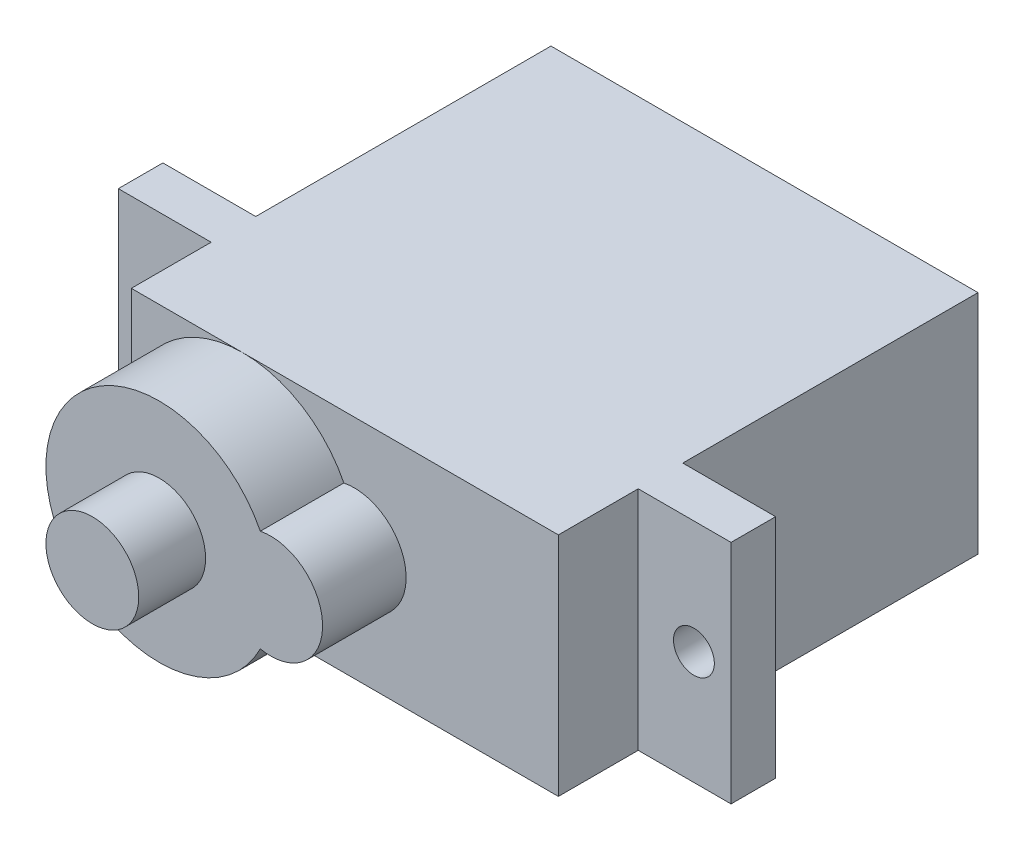
ISO-10303-21;
HEADER;
FILE_DESCRIPTION(('STEP AP214'),'2;1');
FILE_NAME('part.step','',(''),(''),'','','');
FILE_SCHEMA(('AUTOMOTIVE_DESIGN { 1 0 10303 214 1 1 1 1 }'));
ENDSEC;
DATA;
#1=APPLICATION_CONTEXT('core data for automotive mechanical design processes');
#2=APPLICATION_PROTOCOL_DEFINITION('international standard','automotive_design',2000,#1);
#3=PRODUCT_CONTEXT('',#1,'mechanical');
#4=PRODUCT('Part','Part','',(#3));
#5=PRODUCT_RELATED_PRODUCT_CATEGORY('part','',(#4));
#6=PRODUCT_DEFINITION_FORMATION('','',#4);
#7=PRODUCT_DEFINITION_CONTEXT('part definition',#1,'design');
#8=PRODUCT_DEFINITION('design','',#6,#7);
#9=PRODUCT_DEFINITION_SHAPE('','',#8);
#10=(LENGTH_UNIT() NAMED_UNIT(*) SI_UNIT(.MILLI.,.METRE.));
#11=(NAMED_UNIT(*) PLANE_ANGLE_UNIT() SI_UNIT($,.RADIAN.));
#12=(NAMED_UNIT(*) SI_UNIT($,.STERADIAN.) SOLID_ANGLE_UNIT());
#13=UNCERTAINTY_MEASURE_WITH_UNIT(LENGTH_MEASURE(1.E-05),#10,'distance_accuracy_value','');
#14=(GEOMETRIC_REPRESENTATION_CONTEXT(3) GLOBAL_UNCERTAINTY_ASSIGNED_CONTEXT((#13)) GLOBAL_UNIT_ASSIGNED_CONTEXT((#10,
#11,#12)) REPRESENTATION_CONTEXT('',''));
#15=CARTESIAN_POINT('',(0.,0.,0.));
#16=DIRECTION('',(0.,0.,1.));
#17=DIRECTION('',(1.,0.,0.));
#18=AXIS2_PLACEMENT_3D('',#15,#16,#17);
#19=CARTESIAN_POINT('',(0.,0.,8.8));
#20=DIRECTION('',(0.,0.,-1.));
#21=DIRECTION('',(-1.,0.,0.));
#22=AXIS2_PLACEMENT_3D('',#19,#20,#21);
#23=CYLINDRICAL_SURFACE('',#22,6.1);
#24=DIRECTION('',(0.,0.,-1.));
#25=VECTOR('',#24,1.);
#26=CARTESIAN_POINT('',(5.4475,-2.74494877001375,6.55));
#27=LINE('',#26,#25);
#28=CARTESIAN_POINT('',(5.4475,-2.74494877001375,8.8));
#29=VERTEX_POINT('',#28);
#30=CARTESIAN_POINT('',(5.4475,-2.74494877001375,4.3));
#31=VERTEX_POINT('',#30);
#32=EDGE_CURVE('E154',#29,#31,#27,.T.);
#33=ORIENTED_EDGE('',*,*,#32,.F.);
#34=CARTESIAN_POINT('',(0.,0.,8.8));
#35=DIRECTION('',(0.,0.,1.));
#36=DIRECTION('',(1.,0.,0.));
#37=AXIS2_PLACEMENT_3D('',#34,#35,#36);
#38=CIRCLE('',#37,6.1);
#39=CARTESIAN_POINT('',(5.4475,2.74494877001375,8.8));
#40=VERTEX_POINT('',#39);
#41=EDGE_CURVE('E155',#40,#29,#38,.T.);
#42=ORIENTED_EDGE('',*,*,#41,.F.);
#43=DIRECTION('',(0.,0.,-1.));
#44=VECTOR('',#43,1.);
#45=CARTESIAN_POINT('',(5.4475,2.74494877001375,6.55));
#46=LINE('',#45,#44);
#47=CARTESIAN_POINT('',(5.4475,2.74494877001375,4.3));
#48=VERTEX_POINT('',#47);
#49=EDGE_CURVE('E57',#48,#40,#46,.F.);
#50=ORIENTED_EDGE('',*,*,#49,.F.);
#51=CARTESIAN_POINT('',(0.,0.,4.3));
#52=DIRECTION('',(0.,0.,1.));
#53=DIRECTION('',(1.,0.,0.));
#54=AXIS2_PLACEMENT_3D('',#51,#52,#53);
#55=CIRCLE('',#54,6.1);
#56=CARTESIAN_POINT('',(0.,6.1,4.3));
#57=VERTEX_POINT('',#56);
#58=EDGE_CURVE('E174',#48,#57,#55,.T.);
#59=ORIENTED_EDGE('',*,*,#58,.T.);
#60=CARTESIAN_POINT('',(-6.,1.1,4.3));
#61=VERTEX_POINT('',#60);
#62=EDGE_CURVE('E158',#57,#61,#55,.T.);
#63=ORIENTED_EDGE('',*,*,#62,.T.);
#64=CARTESIAN_POINT('',(-6.,-1.1,4.3));
#65=VERTEX_POINT('',#64);
#66=EDGE_CURVE('E171',#61,#65,#55,.T.);
#67=ORIENTED_EDGE('',*,*,#66,.T.);
#68=CARTESIAN_POINT('',(0.,-6.1,4.3));
#69=VERTEX_POINT('',#68);
#70=EDGE_CURVE('E48',#65,#69,#55,.T.);
#71=ORIENTED_EDGE('',*,*,#70,.T.);
#72=EDGE_CURVE('E176',#69,#31,#55,.T.);
#73=ORIENTED_EDGE('',*,*,#72,.T.);
#74=EDGE_LOOP('',(#33,#42,#50,#59,#63,#67,#71,#73));
#75=FACE_BOUND('',#74,.T.);
#76=ADVANCED_FACE('F39',(#75),#23,.T.);
#77=CARTESIAN_POINT('',(0.,0.,4.3));
#78=DIRECTION('',(0.,0.,-1.));
#79=DIRECTION('',(-1.,0.,0.));
#80=AXIS2_PLACEMENT_3D('',#77,#78,#79);
#81=PLANE('',#80);
#82=ORIENTED_EDGE('',*,*,#62,.F.);
#83=DIRECTION('',(-1.,0.,0.));
#84=VECTOR('',#83,1.);
#85=CARTESIAN_POINT('',(-6.,6.1,4.3));
#86=LINE('',#85,#84);
#87=CARTESIAN_POINT('',(-6.,6.1,4.3));
#88=VERTEX_POINT('',#87);
#89=EDGE_CURVE('E230',#57,#88,#86,.T.);
#90=ORIENTED_EDGE('',*,*,#89,.T.);
#91=DIRECTION('',(0.,-1.,0.));
#92=VECTOR('',#91,1.);
#93=CARTESIAN_POINT('',(-6.,-6.1,4.3));
#94=LINE('',#93,#92);
#95=EDGE_CURVE('E216',#88,#61,#94,.T.);
#96=ORIENTED_EDGE('',*,*,#95,.T.);
#97=EDGE_LOOP('',(#82,#90,#96));
#98=FACE_BOUND('',#97,.T.);
#99=ADVANCED_FACE('F297',(#98),#81,.F.);
#100=ORIENTED_EDGE('',*,*,#70,.F.);
#101=CARTESIAN_POINT('',(-6.,-6.1,4.3));
#102=VERTEX_POINT('',#101);
#103=EDGE_CURVE('E224',#65,#102,#94,.T.);
#104=ORIENTED_EDGE('',*,*,#103,.T.);
#105=DIRECTION('',(1.,0.,0.));
#106=VECTOR('',#105,1.);
#107=CARTESIAN_POINT('',(-6.,-6.1,4.3));
#108=LINE('',#107,#106);
#109=EDGE_CURVE('E223',#102,#69,#108,.T.);
#110=ORIENTED_EDGE('',*,*,#109,.T.);
#111=EDGE_LOOP('',(#100,#104,#110));
#112=FACE_BOUND('',#111,.T.);
#113=ADVANCED_FACE('F306',(#112),#81,.F.);
#114=CARTESIAN_POINT('',(-6.,-6.1,4.3));
#115=DIRECTION('',(1.,0.,0.));
#116=DIRECTION('',(0.,0.,-1.));
#117=AXIS2_PLACEMENT_3D('',#114,#115,#116);
#118=PLANE('',#117);
#119=DIRECTION('',(0.,1.,0.));
#120=VECTOR('',#119,1.);
#121=CARTESIAN_POINT('',(-6.,-6.1,0.));
#122=LINE('',#121,#120);
#123=CARTESIAN_POINT('',(-6.,-6.1,0.));
#124=VERTEX_POINT('',#123);
#125=CARTESIAN_POINT('',(-6.,6.1,0.));
#126=VERTEX_POINT('',#125);
#127=EDGE_CURVE('E213',#124,#126,#122,.T.);
#128=ORIENTED_EDGE('',*,*,#127,.F.);
#129=DIRECTION('',(0.,0.,-1.));
#130=VECTOR('',#129,1.);
#131=CARTESIAN_POINT('',(-6.,-6.1,4.3));
#132=LINE('',#131,#130);
#133=EDGE_CURVE('E260',#102,#124,#132,.T.);
#134=ORIENTED_EDGE('',*,*,#133,.F.);
#135=ORIENTED_EDGE('',*,*,#103,.F.);
#136=EDGE_CURVE('E222',#61,#65,#94,.T.);
#137=ORIENTED_EDGE('',*,*,#136,.F.);
#138=ORIENTED_EDGE('',*,*,#95,.F.);
#139=DIRECTION('',(0.,0.,-1.));
#140=VECTOR('',#139,1.);
#141=CARTESIAN_POINT('',(-6.,6.1,4.3));
#142=LINE('',#141,#140);
#143=EDGE_CURVE('E244',#88,#126,#142,.T.);
#144=ORIENTED_EDGE('',*,*,#143,.T.);
#145=EDGE_LOOP('',(#128,#134,#135,#137,#138,#144));
#146=FACE_BOUND('',#145,.T.);
#147=ADVANCED_FACE('F350',(#146),#118,.F.);
#148=CARTESIAN_POINT('',(17.,-6.1,4.3));
#149=DIRECTION('',(-1.,0.,0.));
#150=DIRECTION('',(0.,0.,1.));
#151=AXIS2_PLACEMENT_3D('',#148,#149,#150);
#152=PLANE('',#151);
#153=DIRECTION('',(0.,-1.,0.));
#154=VECTOR('',#153,1.);
#155=CARTESIAN_POINT('',(17.,-6.1,0.));
#156=LINE('',#155,#154);
#157=CARTESIAN_POINT('',(17.,6.1,0.));
#158=VERTEX_POINT('',#157);
#159=CARTESIAN_POINT('',(17.,-6.1,0.));
#160=VERTEX_POINT('',#159);
#161=EDGE_CURVE('E261',#158,#160,#156,.T.);
#162=ORIENTED_EDGE('',*,*,#161,.F.);
#163=DIRECTION('',(0.,0.,-1.));
#164=VECTOR('',#163,1.);
#165=CARTESIAN_POINT('',(17.,6.1,4.3));
#166=LINE('',#165,#164);
#167=CARTESIAN_POINT('',(17.,6.1,4.3));
#168=VERTEX_POINT('',#167);
#169=EDGE_CURVE('E248',#168,#158,#166,.T.);
#170=ORIENTED_EDGE('',*,*,#169,.F.);
#171=DIRECTION('',(0.,1.,0.));
#172=VECTOR('',#171,1.);
#173=CARTESIAN_POINT('',(17.,-6.1,4.3));
#174=LINE('',#173,#172);
#175=CARTESIAN_POINT('',(17.,-6.1,4.3));
#176=VERTEX_POINT('',#175);
#177=EDGE_CURVE('E227',#176,#168,#174,.T.);
#178=ORIENTED_EDGE('',*,*,#177,.F.);
#179=DIRECTION('',(0.,0.,-1.));
#180=VECTOR('',#179,1.);
#181=CARTESIAN_POINT('',(17.,-6.1,4.3));
#182=LINE('',#181,#180);
#183=EDGE_CURVE('E254',#176,#160,#182,.T.);
#184=ORIENTED_EDGE('',*,*,#183,.T.);
#185=EDGE_LOOP('',(#162,#170,#178,#184));
#186=FACE_BOUND('',#185,.T.);
#187=ADVANCED_FACE('F339',(#186),#152,.F.);
#188=CARTESIAN_POINT('',(-6.,-6.1,-2.4));
#189=VERTEX_POINT('',#188);
#190=CARTESIAN_POINT('',(-6.,-6.1,-18.3));
#191=VERTEX_POINT('',#190);
#192=EDGE_CURVE('E257',#189,#191,#132,.T.);
#193=ORIENTED_EDGE('',*,*,#192,.F.);
#194=DIRECTION('',(0.,1.,0.));
#195=VECTOR('',#194,1.);
#196=CARTESIAN_POINT('',(-6.,-6.1,-2.4));
#197=LINE('',#196,#195);
#198=CARTESIAN_POINT('',(-6.,6.1,-2.4));
#199=VERTEX_POINT('',#198);
#200=EDGE_CURVE('E215',#189,#199,#197,.T.);
#201=ORIENTED_EDGE('',*,*,#200,.T.);
#202=CARTESIAN_POINT('',(-6.,6.1,-18.3));
#203=VERTEX_POINT('',#202);
#204=EDGE_CURVE('E231',#199,#203,#142,.T.);
#205=ORIENTED_EDGE('',*,*,#204,.T.);
#206=DIRECTION('',(0.,-1.,0.));
#207=VECTOR('',#206,1.);
#208=CARTESIAN_POINT('',(-6.,-6.1,-18.3));
#209=LINE('',#208,#207);
#210=EDGE_CURVE('E220',#203,#191,#209,.T.);
#211=ORIENTED_EDGE('',*,*,#210,.T.);
#212=EDGE_LOOP('',(#193,#201,#205,#211));
#213=FACE_BOUND('',#212,.T.);
#214=ADVANCED_FACE('F41',(#213),#118,.F.);
#215=CARTESIAN_POINT('',(-6.,-6.1,4.3));
#216=DIRECTION('',(0.,1.,0.));
#217=DIRECTION('',(0.,0.,1.));
#218=AXIS2_PLACEMENT_3D('',#215,#216,#217);
#219=PLANE('',#218);
#220=ORIENTED_EDGE('',*,*,#133,.T.);
#221=DIRECTION('',(1.,0.,0.));
#222=VECTOR('',#221,1.);
#223=CARTESIAN_POINT('',(-11.,-6.1,0.));
#224=LINE('',#223,#222);
#225=CARTESIAN_POINT('',(-11.,-6.1,0.));
#226=VERTEX_POINT('',#225);
#227=EDGE_CURVE('E185',#226,#124,#224,.T.);
#228=ORIENTED_EDGE('',*,*,#227,.F.);
#229=DIRECTION('',(0.,0.,-1.));
#230=VECTOR('',#229,1.);
#231=CARTESIAN_POINT('',(-11.,-6.1,0.));
#232=LINE('',#231,#230);
#233=CARTESIAN_POINT('',(-11.,-6.1,-2.4));
#234=VERTEX_POINT('',#233);
#235=EDGE_CURVE('E209',#226,#234,#232,.T.);
#236=ORIENTED_EDGE('',*,*,#235,.T.);
#237=DIRECTION('',(1.,0.,0.));
#238=VECTOR('',#237,1.);
#239=CARTESIAN_POINT('',(-11.,-6.1,-2.4));
#240=LINE('',#239,#238);
#241=EDGE_CURVE('E194',#234,#189,#240,.T.);
#242=ORIENTED_EDGE('',*,*,#241,.T.);
#243=ORIENTED_EDGE('',*,*,#192,.T.);
#244=DIRECTION('',(1.,0.,0.));
#245=VECTOR('',#244,1.);
#246=CARTESIAN_POINT('',(-6.,-6.1,-18.3));
#247=LINE('',#246,#245);
#248=CARTESIAN_POINT('',(17.,-6.1,-18.3));
#249=VERTEX_POINT('',#248);
#250=EDGE_CURVE('E236',#191,#249,#247,.T.);
#251=ORIENTED_EDGE('',*,*,#250,.T.);
#252=CARTESIAN_POINT('',(17.,-6.1,-2.4));
#253=VERTEX_POINT('',#252);
#254=EDGE_CURVE('E255',#253,#249,#182,.T.);
#255=ORIENTED_EDGE('',*,*,#254,.F.);
#256=CARTESIAN_POINT('',(22.,-6.1,-2.4));
#257=VERTEX_POINT('',#256);
#258=EDGE_CURVE('E195',#253,#257,#240,.T.);
#259=ORIENTED_EDGE('',*,*,#258,.T.);
#260=DIRECTION('',(0.,0.,-1.));
#261=VECTOR('',#260,1.);
#262=CARTESIAN_POINT('',(22.,-6.1,0.));
#263=LINE('',#262,#261);
#264=CARTESIAN_POINT('',(22.,-6.1,0.));
#265=VERTEX_POINT('',#264);
#266=EDGE_CURVE('E207',#265,#257,#263,.T.);
#267=ORIENTED_EDGE('',*,*,#266,.F.);
#268=EDGE_CURVE('E179',#160,#265,#224,.T.);
#269=ORIENTED_EDGE('',*,*,#268,.F.);
#270=ORIENTED_EDGE('',*,*,#183,.F.);
#271=EDGE_CURVE('E221',#69,#176,#108,.T.);
#272=ORIENTED_EDGE('',*,*,#271,.F.);
#273=ORIENTED_EDGE('',*,*,#109,.F.);
#274=EDGE_LOOP('',(#220,#228,#236,#242,#243,#251,#255,#259,#267,#269,#270,#272,#273));
#275=FACE_BOUND('',#274,.T.);
#276=ADVANCED_FACE('F340',(#275),#219,.F.);
#277=CARTESIAN_POINT('',(17.,6.1,-2.4));
#278=VERTEX_POINT('',#277);
#279=CARTESIAN_POINT('',(17.,6.1,-18.3));
#280=VERTEX_POINT('',#279);
#281=EDGE_CURVE('E247',#278,#280,#166,.T.);
#282=ORIENTED_EDGE('',*,*,#281,.F.);
#283=DIRECTION('',(0.,-1.,0.));
#284=VECTOR('',#283,1.);
#285=CARTESIAN_POINT('',(17.,-6.1,-2.4));
#286=LINE('',#285,#284);
#287=EDGE_CURVE('E258',#278,#253,#286,.T.);
#288=ORIENTED_EDGE('',*,*,#287,.T.);
#289=ORIENTED_EDGE('',*,*,#254,.T.);
#290=DIRECTION('',(0.,1.,0.));
#291=VECTOR('',#290,1.);
#292=CARTESIAN_POINT('',(17.,-6.1,-18.3));
#293=LINE('',#292,#291);
#294=EDGE_CURVE('E237',#249,#280,#293,.T.);
#295=ORIENTED_EDGE('',*,*,#294,.T.);
#296=EDGE_LOOP('',(#282,#288,#289,#295));
#297=FACE_BOUND('',#296,.T.);
#298=ADVANCED_FACE('F333',(#297),#152,.F.);
#299=CARTESIAN_POINT('',(-6.,6.1,4.3));
#300=DIRECTION('',(0.,-1.,0.));
#301=DIRECTION('',(0.,0.,-1.));
#302=AXIS2_PLACEMENT_3D('',#299,#300,#301);
#303=PLANE('',#302);
#304=ORIENTED_EDGE('',*,*,#169,.T.);
#305=DIRECTION('',(-1.,0.,0.));
#306=VECTOR('',#305,1.);
#307=CARTESIAN_POINT('',(-11.,6.1,0.));
#308=LINE('',#307,#306);
#309=CARTESIAN_POINT('',(22.,6.1,0.));
#310=VERTEX_POINT('',#309);
#311=EDGE_CURVE('E190',#310,#158,#308,.T.);
#312=ORIENTED_EDGE('',*,*,#311,.F.);
#313=DIRECTION('',(0.,0.,-1.));
#314=VECTOR('',#313,1.);
#315=CARTESIAN_POINT('',(22.,6.1,0.));
#316=LINE('',#315,#314);
#317=CARTESIAN_POINT('',(22.,6.1,-2.4));
#318=VERTEX_POINT('',#317);
#319=EDGE_CURVE('E204',#310,#318,#316,.T.);
#320=ORIENTED_EDGE('',*,*,#319,.T.);
#321=DIRECTION('',(-1.,0.,0.));
#322=VECTOR('',#321,1.);
#323=CARTESIAN_POINT('',(-11.,6.1,-2.4));
#324=LINE('',#323,#322);
#325=EDGE_CURVE('E181',#318,#278,#324,.T.);
#326=ORIENTED_EDGE('',*,*,#325,.T.);
#327=ORIENTED_EDGE('',*,*,#281,.T.);
#328=DIRECTION('',(-1.,0.,0.));
#329=VECTOR('',#328,1.);
#330=CARTESIAN_POINT('',(-6.,6.1,-18.3));
#331=LINE('',#330,#329);
#332=EDGE_CURVE('E245',#280,#203,#331,.T.);
#333=ORIENTED_EDGE('',*,*,#332,.T.);
#334=ORIENTED_EDGE('',*,*,#204,.F.);
#335=CARTESIAN_POINT('',(-11.,6.1,-2.4));
#336=VERTEX_POINT('',#335);
#337=EDGE_CURVE('E196',#199,#336,#324,.T.);
#338=ORIENTED_EDGE('',*,*,#337,.T.);
#339=DIRECTION('',(0.,0.,-1.));
#340=VECTOR('',#339,1.);
#341=CARTESIAN_POINT('',(-11.,6.1,0.));
#342=LINE('',#341,#340);
#343=CARTESIAN_POINT('',(-11.,6.1,0.));
#344=VERTEX_POINT('',#343);
#345=EDGE_CURVE('E186',#344,#336,#342,.T.);
#346=ORIENTED_EDGE('',*,*,#345,.F.);
#347=EDGE_CURVE('E187',#126,#344,#308,.T.);
#348=ORIENTED_EDGE('',*,*,#347,.F.);
#349=ORIENTED_EDGE('',*,*,#143,.F.);
#350=ORIENTED_EDGE('',*,*,#89,.F.);
#351=EDGE_CURVE('E229',#168,#57,#86,.T.);
#352=ORIENTED_EDGE('',*,*,#351,.F.);
#353=EDGE_LOOP('',(#304,#312,#320,#326,#327,#333,#334,#338,#346,#348,#349,#350,#352));
#354=FACE_BOUND('',#353,.T.);
#355=ADVANCED_FACE('F326',(#354),#303,.F.);
#356=CARTESIAN_POINT('',(6.,0.,4.3));
#357=DIRECTION('',(0.,0.,1.));
#358=DIRECTION('',(1.,0.,0.));
#359=AXIS2_PLACEMENT_3D('',#356,#357,#358);
#360=CIRCLE('',#359,2.8);
#361=EDGE_CURVE('E64',#31,#48,#360,.T.);
#362=ORIENTED_EDGE('',*,*,#361,.F.);
#363=ORIENTED_EDGE('',*,*,#72,.F.);
#364=ORIENTED_EDGE('',*,*,#271,.T.);
#365=ORIENTED_EDGE('',*,*,#177,.T.);
#366=ORIENTED_EDGE('',*,*,#351,.T.);
#367=ORIENTED_EDGE('',*,*,#58,.F.);
#368=EDGE_LOOP('',(#362,#363,#364,#365,#366,#367));
#369=FACE_BOUND('',#368,.T.);
#370=ADVANCED_FACE('F307',(#369),#81,.F.);
#371=CARTESIAN_POINT('',(0.,0.,-18.3));
#372=DIRECTION('',(0.,0.,-1.));
#373=DIRECTION('',(-1.,0.,0.));
#374=AXIS2_PLACEMENT_3D('',#371,#372,#373);
#375=PLANE('',#374);
#376=ORIENTED_EDGE('',*,*,#210,.F.);
#377=ORIENTED_EDGE('',*,*,#332,.F.);
#378=ORIENTED_EDGE('',*,*,#294,.F.);
#379=ORIENTED_EDGE('',*,*,#250,.F.);
#380=EDGE_LOOP('',(#376,#377,#378,#379));
#381=FACE_BOUND('',#380,.T.);
#382=ADVANCED_FACE('F324',(#381),#375,.T.);
#383=CARTESIAN_POINT('',(22.,-6.1,0.));
#384=DIRECTION('',(-1.,0.,0.));
#385=DIRECTION('',(0.,0.,1.));
#386=AXIS2_PLACEMENT_3D('',#383,#384,#385);
#387=PLANE('',#386);
#388=DIRECTION('',(0.,1.,0.));
#389=VECTOR('',#388,1.);
#390=CARTESIAN_POINT('',(22.,-6.1,-2.4));
#391=LINE('',#390,#389);
#392=EDGE_CURVE('E198',#257,#318,#391,.T.);
#393=ORIENTED_EDGE('',*,*,#392,.T.);
#394=ORIENTED_EDGE('',*,*,#319,.F.);
#395=DIRECTION('',(0.,1.,0.));
#396=VECTOR('',#395,1.);
#397=CARTESIAN_POINT('',(22.,-6.1,0.));
#398=LINE('',#397,#396);
#399=EDGE_CURVE('E183',#265,#310,#398,.T.);
#400=ORIENTED_EDGE('',*,*,#399,.F.);
#401=ORIENTED_EDGE('',*,*,#266,.T.);
#402=EDGE_LOOP('',(#393,#394,#400,#401));
#403=FACE_BOUND('',#402,.T.);
#404=ADVANCED_FACE('F318',(#403),#387,.F.);
#405=CARTESIAN_POINT('',(0.,0.,-2.4));
#406=DIRECTION('',(0.,0.,-1.));
#407=DIRECTION('',(-1.,0.,0.));
#408=AXIS2_PLACEMENT_3D('',#405,#406,#407);
#409=PLANE('',#408);
#410=CARTESIAN_POINT('',(20.,0.,-2.4));
#411=DIRECTION('',(0.,0.,-1.));
#412=DIRECTION('',(-1.,0.,0.));
#413=AXIS2_PLACEMENT_3D('',#410,#411,#412);
#414=CIRCLE('',#413,1.1);
#415=CARTESIAN_POINT('',(18.9,0.,-2.4));
#416=VERTEX_POINT('',#415);
#417=EDGE_CURVE('E274',#416,#416,#414,.F.);
#418=ORIENTED_EDGE('',*,*,#417,.T.);
#419=EDGE_LOOP('',(#418));
#420=FACE_BOUND('',#419,.T.);
#421=ORIENTED_EDGE('',*,*,#287,.F.);
#422=ORIENTED_EDGE('',*,*,#325,.F.);
#423=ORIENTED_EDGE('',*,*,#392,.F.);
#424=ORIENTED_EDGE('',*,*,#258,.F.);
#425=EDGE_LOOP('',(#421,#422,#423,#424));
#426=FACE_BOUND('',#425,.T.);
#427=ADVANCED_FACE('F316',(#420,#426),#409,.T.);
#428=CARTESIAN_POINT('',(0.,0.,0.));
#429=DIRECTION('',(0.,0.,-1.));
#430=DIRECTION('',(-1.,0.,0.));
#431=AXIS2_PLACEMENT_3D('',#428,#429,#430);
#432=PLANE('',#431);
#433=CARTESIAN_POINT('',(20.,0.,0.));
#434=DIRECTION('',(0.,0.,-1.));
#435=DIRECTION('',(-1.,0.,0.));
#436=AXIS2_PLACEMENT_3D('',#433,#434,#435);
#437=CIRCLE('',#436,1.1);
#438=CARTESIAN_POINT('',(18.9,0.,0.));
#439=VERTEX_POINT('',#438);
#440=EDGE_CURVE('E43',#439,#439,#437,.F.);
#441=ORIENTED_EDGE('',*,*,#440,.F.);
#442=EDGE_LOOP('',(#441));
#443=FACE_BOUND('',#442,.T.);
#444=ORIENTED_EDGE('',*,*,#311,.T.);
#445=ORIENTED_EDGE('',*,*,#161,.T.);
#446=ORIENTED_EDGE('',*,*,#268,.T.);
#447=ORIENTED_EDGE('',*,*,#399,.T.);
#448=EDGE_LOOP('',(#444,#445,#446,#447));
#449=FACE_BOUND('',#448,.T.);
#450=ADVANCED_FACE('F314',(#443,#449),#432,.F.);
#451=CARTESIAN_POINT('',(-9.,0.,0.));
#452=DIRECTION('',(0.,0.,-1.));
#453=DIRECTION('',(-1.,0.,0.));
#454=AXIS2_PLACEMENT_3D('',#451,#452,#453);
#455=CIRCLE('',#454,1.1);
#456=CARTESIAN_POINT('',(-10.1,0.,0.));
#457=VERTEX_POINT('',#456);
#458=EDGE_CURVE('E266',#457,#457,#455,.F.);
#459=ORIENTED_EDGE('',*,*,#458,.F.);
#460=EDGE_LOOP('',(#459));
#461=FACE_BOUND('',#460,.T.);
#462=ORIENTED_EDGE('',*,*,#227,.T.);
#463=ORIENTED_EDGE('',*,*,#127,.T.);
#464=ORIENTED_EDGE('',*,*,#347,.T.);
#465=DIRECTION('',(0.,-1.,0.));
#466=VECTOR('',#465,1.);
#467=CARTESIAN_POINT('',(-11.,-6.1,0.));
#468=LINE('',#467,#466);
#469=EDGE_CURVE('E180',#344,#226,#468,.T.);
#470=ORIENTED_EDGE('',*,*,#469,.T.);
#471=EDGE_LOOP('',(#462,#463,#464,#470));
#472=FACE_BOUND('',#471,.T.);
#473=ADVANCED_FACE('F311',(#461,#472),#432,.F.);
#474=CARTESIAN_POINT('',(-9.,0.,-2.4));
#475=DIRECTION('',(0.,0.,-1.));
#476=DIRECTION('',(-1.,0.,0.));
#477=AXIS2_PLACEMENT_3D('',#474,#475,#476);
#478=CIRCLE('',#477,1.1);
#479=CARTESIAN_POINT('',(-10.1,0.,-2.4));
#480=VERTEX_POINT('',#479);
#481=EDGE_CURVE('E264',#480,#480,#478,.F.);
#482=ORIENTED_EDGE('',*,*,#481,.T.);
#483=EDGE_LOOP('',(#482));
#484=FACE_BOUND('',#483,.T.);
#485=ORIENTED_EDGE('',*,*,#200,.F.);
#486=ORIENTED_EDGE('',*,*,#241,.F.);
#487=DIRECTION('',(0.,-1.,0.));
#488=VECTOR('',#487,1.);
#489=CARTESIAN_POINT('',(-11.,-6.1,-2.4));
#490=LINE('',#489,#488);
#491=EDGE_CURVE('E159',#336,#234,#490,.T.);
#492=ORIENTED_EDGE('',*,*,#491,.F.);
#493=ORIENTED_EDGE('',*,*,#337,.F.);
#494=EDGE_LOOP('',(#485,#486,#492,#493));
#495=FACE_BOUND('',#494,.T.);
#496=ADVANCED_FACE('F313',(#484,#495),#409,.T.);
#497=CARTESIAN_POINT('',(-11.,-6.1,0.));
#498=DIRECTION('',(1.,0.,0.));
#499=DIRECTION('',(0.,0.,-1.));
#500=AXIS2_PLACEMENT_3D('',#497,#498,#499);
#501=PLANE('',#500);
#502=ORIENTED_EDGE('',*,*,#491,.T.);
#503=ORIENTED_EDGE('',*,*,#235,.F.);
#504=ORIENTED_EDGE('',*,*,#469,.F.);
#505=ORIENTED_EDGE('',*,*,#345,.T.);
#506=EDGE_LOOP('',(#502,#503,#504,#505));
#507=FACE_BOUND('',#506,.T.);
#508=ADVANCED_FACE('F298',(#507),#501,.F.);
#509=CARTESIAN_POINT('',(0.,0.,4.3));
#510=DIRECTION('',(0.,0.,1.));
#511=DIRECTION('',(1.,0.,0.));
#512=AXIS2_PLACEMENT_3D('',#509,#510,#511);
#513=PLANE('',#512);
#514=ORIENTED_EDGE('',*,*,#66,.F.);
#515=ORIENTED_EDGE('',*,*,#136,.T.);
#516=EDGE_LOOP('',(#514,#515));
#517=FACE_BOUND('',#516,.T.);
#518=ADVANCED_FACE('F288',(#517),#513,.F.);
#519=CARTESIAN_POINT('',(0.,0.,8.8));
#520=DIRECTION('',(0.,0.,1.));
#521=DIRECTION('',(1.,0.,0.));
#522=AXIS2_PLACEMENT_3D('',#519,#520,#521);
#523=PLANE('',#522);
#524=CARTESIAN_POINT('',(0.,0.,8.8));
#525=DIRECTION('',(0.,0.,1.));
#526=DIRECTION('',(1.,0.,0.));
#527=AXIS2_PLACEMENT_3D('',#524,#525,#526);
#528=CIRCLE('',#527,2.5);
#529=CARTESIAN_POINT('',(2.5,0.,8.8));
#530=VERTEX_POINT('',#529);
#531=EDGE_CURVE('E11',#530,#530,#528,.T.);
#532=ORIENTED_EDGE('',*,*,#531,.F.);
#533=EDGE_LOOP('',(#532));
#534=FACE_BOUND('',#533,.T.);
#535=ORIENTED_EDGE('',*,*,#41,.T.);
#536=CARTESIAN_POINT('',(6.,0.,8.8));
#537=DIRECTION('',(0.,0.,1.));
#538=DIRECTION('',(1.,0.,0.));
#539=AXIS2_PLACEMENT_3D('',#536,#537,#538);
#540=CIRCLE('',#539,2.8);
#541=EDGE_CURVE('E161',#29,#40,#540,.T.);
#542=ORIENTED_EDGE('',*,*,#541,.T.);
#543=EDGE_LOOP('',(#535,#542));
#544=FACE_BOUND('',#543,.T.);
#545=ADVANCED_FACE('F164',(#534,#544),#523,.T.);
#546=CARTESIAN_POINT('',(6.,0.,8.8));
#547=DIRECTION('',(0.,0.,-1.));
#548=DIRECTION('',(-1.,0.,0.));
#549=AXIS2_PLACEMENT_3D('',#546,#547,#548);
#550=CYLINDRICAL_SURFACE('',#549,2.8);
#551=ORIENTED_EDGE('',*,*,#541,.F.);
#552=ORIENTED_EDGE('',*,*,#32,.T.);
#553=ORIENTED_EDGE('',*,*,#361,.T.);
#554=ORIENTED_EDGE('',*,*,#49,.T.);
#555=EDGE_LOOP('',(#551,#552,#553,#554));
#556=FACE_BOUND('',#555,.T.);
#557=ADVANCED_FACE('F162',(#556),#550,.T.);
#558=CARTESIAN_POINT('',(0.,0.,12.4));
#559=DIRECTION('',(0.,0.,-1.));
#560=DIRECTION('',(-1.,0.,0.));
#561=AXIS2_PLACEMENT_3D('',#558,#559,#560);
#562=CYLINDRICAL_SURFACE('',#561,2.5);
#563=CARTESIAN_POINT('',(0.,0.,12.4));
#564=DIRECTION('',(0.,0.,1.));
#565=DIRECTION('',(1.,0.,0.));
#566=AXIS2_PLACEMENT_3D('',#563,#564,#565);
#567=CIRCLE('',#566,2.5);
#568=CARTESIAN_POINT('',(2.5,0.,12.4));
#569=VERTEX_POINT('',#568);
#570=EDGE_CURVE('E170',#569,#569,#567,.T.);
#571=ORIENTED_EDGE('',*,*,#570,.F.);
#572=EDGE_LOOP('',(#571));
#573=FACE_BOUND('',#572,.T.);
#574=ORIENTED_EDGE('',*,*,#531,.T.);
#575=EDGE_LOOP('',(#574));
#576=FACE_BOUND('',#575,.T.);
#577=ADVANCED_FACE('F285',(#573,#576),#562,.T.);
#578=CARTESIAN_POINT('',(0.,0.,12.4));
#579=DIRECTION('',(0.,0.,1.));
#580=DIRECTION('',(1.,0.,0.));
#581=AXIS2_PLACEMENT_3D('',#578,#579,#580);
#582=PLANE('',#581);
#583=ORIENTED_EDGE('',*,*,#570,.T.);
#584=EDGE_LOOP('',(#583));
#585=FACE_BOUND('',#584,.T.);
#586=ADVANCED_FACE('F278',(#585),#582,.T.);
#587=CARTESIAN_POINT('',(-9.,0.,12.4));
#588=DIRECTION('',(0.,0.,-1.));
#589=DIRECTION('',(-1.,0.,0.));
#590=AXIS2_PLACEMENT_3D('',#587,#588,#589);
#591=CYLINDRICAL_SURFACE('',#590,1.1);
#592=ORIENTED_EDGE('',*,*,#481,.F.);
#593=EDGE_LOOP('',(#592));
#594=FACE_BOUND('',#593,.T.);
#595=ORIENTED_EDGE('',*,*,#458,.T.);
#596=EDGE_LOOP('',(#595));
#597=FACE_BOUND('',#596,.T.);
#598=ADVANCED_FACE('F475',(#594,#597),#591,.F.);
#599=CARTESIAN_POINT('',(20.,0.,12.4));
#600=DIRECTION('',(0.,0.,-1.));
#601=DIRECTION('',(-1.,0.,0.));
#602=AXIS2_PLACEMENT_3D('',#599,#600,#601);
#603=CYLINDRICAL_SURFACE('',#602,1.1);
#604=ORIENTED_EDGE('',*,*,#417,.F.);
#605=EDGE_LOOP('',(#604));
#606=FACE_BOUND('',#605,.T.);
#607=ORIENTED_EDGE('',*,*,#440,.T.);
#608=EDGE_LOOP('',(#607));
#609=FACE_BOUND('',#608,.T.);
#610=ADVANCED_FACE('F477',(#606,#609),#603,.F.);
#611=CLOSED_SHELL('',(#76,#99,#113,#147,#187,#214,#276,#298,#355,#370,#382,#404,#427,#450,#473,
#496,#508,#518,#545,#557,#577,#586,#598,#610));
#612=MANIFOLD_SOLID_BREP('B2',#611);
#613=ADVANCED_BREP_SHAPE_REPRESENTATION('',(#18,#612),#14);
#614=SHAPE_DEFINITION_REPRESENTATION(#9,#613);
ENDSEC;
END-ISO-10303-21;
